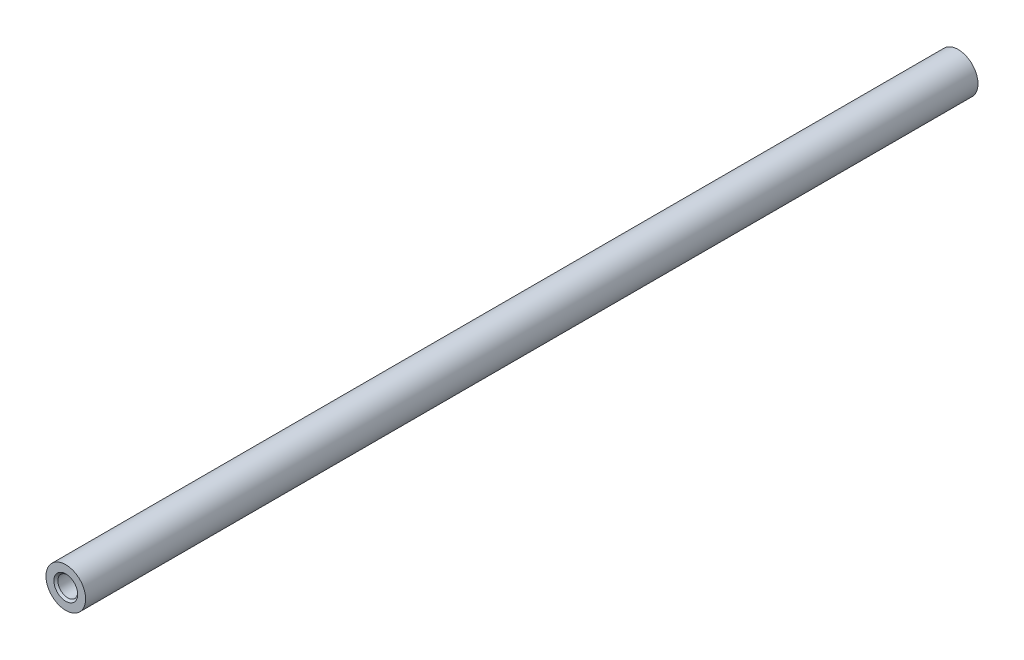
ISO-10303-21;
HEADER;
FILE_DESCRIPTION(('STEP AP214'),'2;1');
FILE_NAME('part.step','',(''),(''),'','','');
FILE_SCHEMA(('AUTOMOTIVE_DESIGN { 1 0 10303 214 1 1 1 1 }'));
ENDSEC;
DATA;
#1=APPLICATION_CONTEXT('core data for automotive mechanical design processes');
#2=APPLICATION_PROTOCOL_DEFINITION('international standard','automotive_design',2000,#1);
#3=PRODUCT_CONTEXT('',#1,'mechanical');
#4=PRODUCT('Part','Part','',(#3));
#5=PRODUCT_RELATED_PRODUCT_CATEGORY('part','',(#4));
#6=PRODUCT_DEFINITION_FORMATION('','',#4);
#7=PRODUCT_DEFINITION_CONTEXT('part definition',#1,'design');
#8=PRODUCT_DEFINITION('design','',#6,#7);
#9=PRODUCT_DEFINITION_SHAPE('','',#8);
#10=(LENGTH_UNIT() NAMED_UNIT(*) SI_UNIT(.MILLI.,.METRE.));
#11=(NAMED_UNIT(*) PLANE_ANGLE_UNIT() SI_UNIT($,.RADIAN.));
#12=(NAMED_UNIT(*) SI_UNIT($,.STERADIAN.) SOLID_ANGLE_UNIT());
#13=UNCERTAINTY_MEASURE_WITH_UNIT(LENGTH_MEASURE(1.E-05),#10,'distance_accuracy_value','');
#14=(GEOMETRIC_REPRESENTATION_CONTEXT(3) GLOBAL_UNCERTAINTY_ASSIGNED_CONTEXT((#13)) GLOBAL_UNIT_ASSIGNED_CONTEXT((#10,
#11,#12)) REPRESENTATION_CONTEXT('',''));
#15=CARTESIAN_POINT('',(0.,0.,0.));
#16=DIRECTION('',(0.,0.,1.));
#17=DIRECTION('',(1.,0.,0.));
#18=AXIS2_PLACEMENT_3D('',#15,#16,#17);
#19=CARTESIAN_POINT('',(0.,0.,450.));
#20=DIRECTION('',(0.,0.,1.));
#21=DIRECTION('',(1.,0.,0.));
#22=AXIS2_PLACEMENT_3D('',#19,#20,#21);
#23=PLANE('',#22);
#24=CARTESIAN_POINT('',(0.,0.,450.));
#25=DIRECTION('',(0.,0.,1.));
#26=DIRECTION('',(1.,0.,0.));
#27=AXIS2_PLACEMENT_3D('',#24,#25,#26);
#28=CIRCLE('',#27,6.00000000000006);
#29=CARTESIAN_POINT('',(6.00000000000006,0.,450.));
#30=VERTEX_POINT('',#29);
#31=EDGE_CURVE('E10',#30,#30,#28,.F.);
#32=ORIENTED_EDGE('',*,*,#31,.T.);
#33=EDGE_LOOP('',(#32));
#34=FACE_BOUND('',#33,.T.);
#35=CARTESIAN_POINT('',(0.,0.,450.));
#36=DIRECTION('',(0.,0.,1.));
#37=DIRECTION('',(1.,0.,0.));
#38=AXIS2_PLACEMENT_3D('',#35,#36,#37);
#39=CIRCLE('',#38,10.);
#40=CARTESIAN_POINT('',(10.,0.,450.));
#41=VERTEX_POINT('',#40);
#42=EDGE_CURVE('E41',#41,#41,#39,.T.);
#43=ORIENTED_EDGE('',*,*,#42,.T.);
#44=EDGE_LOOP('',(#43));
#45=FACE_BOUND('',#44,.T.);
#46=ADVANCED_FACE('F30',(#34,#45),#23,.T.);
#47=CARTESIAN_POINT('',(0.,0.,0.));
#48=DIRECTION('',(0.,0.,1.));
#49=DIRECTION('',(1.,0.,0.));
#50=AXIS2_PLACEMENT_3D('',#47,#48,#49);
#51=PLANE('',#50);
#52=CARTESIAN_POINT('',(0.,0.,0.));
#53=DIRECTION('',(0.,0.,1.));
#54=DIRECTION('',(1.,0.,0.));
#55=AXIS2_PLACEMENT_3D('',#52,#53,#54);
#56=CIRCLE('',#55,10.);
#57=CARTESIAN_POINT('',(10.,0.,0.));
#58=VERTEX_POINT('',#57);
#59=EDGE_CURVE('E45',#58,#58,#56,.T.);
#60=ORIENTED_EDGE('',*,*,#59,.F.);
#61=EDGE_LOOP('',(#60));
#62=FACE_BOUND('',#61,.T.);
#63=CARTESIAN_POINT('',(0.,0.,0.));
#64=DIRECTION('',(0.,0.,1.));
#65=DIRECTION('',(1.,0.,0.));
#66=AXIS2_PLACEMENT_3D('',#63,#64,#65);
#67=CIRCLE('',#66,5.);
#68=CARTESIAN_POINT('',(5.,0.,0.));
#69=VERTEX_POINT('',#68);
#70=EDGE_CURVE('E49',#69,#69,#67,.T.);
#71=ORIENTED_EDGE('',*,*,#70,.T.);
#72=EDGE_LOOP('',(#71));
#73=FACE_BOUND('',#72,.T.);
#74=ADVANCED_FACE('F54',(#62,#73),#51,.F.);
#75=CARTESIAN_POINT('',(0.,0.,450.));
#76=DIRECTION('',(0.,0.,-1.));
#77=DIRECTION('',(-1.,0.,0.));
#78=AXIS2_PLACEMENT_3D('',#75,#76,#77);
#79=CYLINDRICAL_SURFACE('',#78,10.);
#80=ORIENTED_EDGE('',*,*,#42,.F.);
#81=EDGE_LOOP('',(#80));
#82=FACE_BOUND('',#81,.T.);
#83=ORIENTED_EDGE('',*,*,#59,.T.);
#84=EDGE_LOOP('',(#83));
#85=FACE_BOUND('',#84,.T.);
#86=ADVANCED_FACE('F58',(#82,#85),#79,.T.);
#87=CARTESIAN_POINT('',(0.,0.,450.));
#88=DIRECTION('',(0.,0.,-1.));
#89=DIRECTION('',(-1.,0.,0.));
#90=AXIS2_PLACEMENT_3D('',#87,#88,#89);
#91=CYLINDRICAL_SURFACE('',#90,5.);
#92=CARTESIAN_POINT('',(0.,0.,449.));
#93=DIRECTION('',(0.,0.,1.));
#94=DIRECTION('',(1.,0.,0.));
#95=AXIS2_PLACEMENT_3D('',#92,#93,#94);
#96=CIRCLE('',#95,5.);
#97=CARTESIAN_POINT('',(5.,0.,449.));
#98=VERTEX_POINT('',#97);
#99=EDGE_CURVE('E37',#98,#98,#96,.T.);
#100=ORIENTED_EDGE('',*,*,#99,.T.);
#101=EDGE_LOOP('',(#100));
#102=FACE_BOUND('',#101,.T.);
#103=ORIENTED_EDGE('',*,*,#70,.F.);
#104=EDGE_LOOP('',(#103));
#105=FACE_BOUND('',#104,.T.);
#106=ADVANCED_FACE('F56',(#102,#105),#91,.F.);
#107=CARTESIAN_POINT('',(0.,0.,449.));
#108=DIRECTION('',(0.,0.,1.));
#109=DIRECTION('',(1.,0.,0.));
#110=AXIS2_PLACEMENT_3D('',#107,#108,#109);
#111=CONICAL_SURFACE('',#110,5.,0.78539816339745);
#112=ORIENTED_EDGE('',*,*,#31,.F.);
#113=EDGE_LOOP('',(#112));
#114=FACE_BOUND('',#113,.T.);
#115=ORIENTED_EDGE('',*,*,#99,.F.);
#116=EDGE_LOOP('',(#115));
#117=FACE_BOUND('',#116,.T.);
#118=ADVANCED_FACE('F32',(#114,#117),#111,.F.);
#119=CLOSED_SHELL('',(#46,#74,#86,#106,#118));
#120=MANIFOLD_SOLID_BREP('B2',#119);
#121=ADVANCED_BREP_SHAPE_REPRESENTATION('',(#18,#120),#14);
#122=SHAPE_DEFINITION_REPRESENTATION(#9,#121);
ENDSEC;
END-ISO-10303-21;
